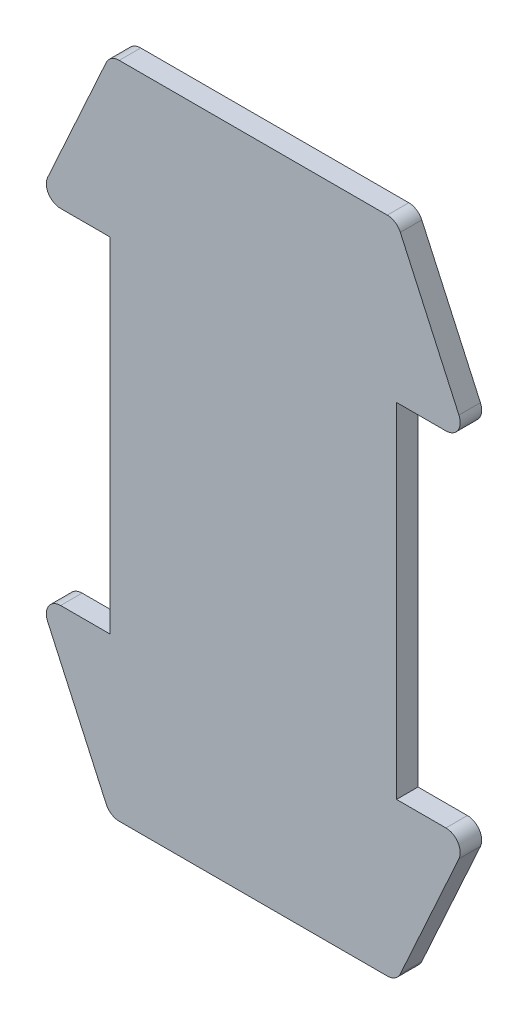
ISO-10303-21;
HEADER;
FILE_DESCRIPTION(('STEP AP214'),'2;1');
FILE_NAME('part.step','',(''),(''),'','','');
FILE_SCHEMA(('AUTOMOTIVE_DESIGN { 1 0 10303 214 1 1 1 1 }'));
ENDSEC;
DATA;
#1=APPLICATION_CONTEXT('core data for automotive mechanical design processes');
#2=APPLICATION_PROTOCOL_DEFINITION('international standard','automotive_design',2000,#1);
#3=PRODUCT_CONTEXT('',#1,'mechanical');
#4=PRODUCT('Part','Part','',(#3));
#5=PRODUCT_RELATED_PRODUCT_CATEGORY('part','',(#4));
#6=PRODUCT_DEFINITION_FORMATION('','',#4);
#7=PRODUCT_DEFINITION_CONTEXT('part definition',#1,'design');
#8=PRODUCT_DEFINITION('design','',#6,#7);
#9=PRODUCT_DEFINITION_SHAPE('','',#8);
#10=(LENGTH_UNIT() NAMED_UNIT(*) SI_UNIT(.MILLI.,.METRE.));
#11=(NAMED_UNIT(*) PLANE_ANGLE_UNIT() SI_UNIT($,.RADIAN.));
#12=(NAMED_UNIT(*) SI_UNIT($,.STERADIAN.) SOLID_ANGLE_UNIT());
#13=UNCERTAINTY_MEASURE_WITH_UNIT(LENGTH_MEASURE(1.E-05),#10,'distance_accuracy_value','');
#14=(GEOMETRIC_REPRESENTATION_CONTEXT(3) GLOBAL_UNCERTAINTY_ASSIGNED_CONTEXT((#13)) GLOBAL_UNIT_ASSIGNED_CONTEXT((#10,
#11,#12)) REPRESENTATION_CONTEXT('',''));
#15=CARTESIAN_POINT('',(0.,0.,0.));
#16=DIRECTION('',(0.,0.,1.));
#17=DIRECTION('',(1.,0.,0.));
#18=AXIS2_PLACEMENT_3D('',#15,#16,#17);
#19=CARTESIAN_POINT('',(-50.,115.,-7.5));
#20=DIRECTION('',(-0.910366477462605,0.413802944301184,0.));
#21=DIRECTION('',(-0.413802944301184,-0.910366477462605,0.));
#22=AXIS2_PLACEMENT_3D('',#19,#20,#21);
#23=PLANE('',#22);
#24=DIRECTION('',(-0.413802944301184,-0.910366477462605,0.));
#25=VECTOR('',#24,1.);
#26=CARTESIAN_POINT('',(-50.,115.,-7.5));
#27=LINE('',#26,#25);
#28=CARTESIAN_POINT('',(-51.3322660356791,112.069014721506,-7.5));
#29=VERTEX_POINT('',#28);
#30=CARTESIAN_POINT('',(-71.7868114902246,67.0690147215059,-7.5));
#31=VERTEX_POINT('',#30);
#32=EDGE_CURVE('E186',#29,#31,#27,.T.);
#33=ORIENTED_EDGE('',*,*,#32,.T.);
#34=DIRECTION('',(0.,0.,1.));
#35=VECTOR('',#34,1.);
#36=CARTESIAN_POINT('',(-71.7868114902246,67.0690147215059,-7.5));
#37=LINE('',#36,#35);
#38=CARTESIAN_POINT('',(-71.7868114902246,67.0690147215059,0.));
#39=VERTEX_POINT('',#38);
#40=EDGE_CURVE('E371',#31,#39,#37,.T.);
#41=ORIENTED_EDGE('',*,*,#40,.T.);
#42=DIRECTION('',(-0.413802944301184,-0.910366477462605,0.));
#43=VECTOR('',#42,1.);
#44=CARTESIAN_POINT('',(-50.,115.,0.));
#45=LINE('',#44,#43);
#46=CARTESIAN_POINT('',(-51.3322660356791,112.069014721506,0.));
#47=VERTEX_POINT('',#46);
#48=EDGE_CURVE('E236',#47,#39,#45,.T.);
#49=ORIENTED_EDGE('',*,*,#48,.F.);
#50=DIRECTION('',(0.,0.,1.));
#51=VECTOR('',#50,1.);
#52=CARTESIAN_POINT('',(-51.3322660356791,112.069014721506,-7.5));
#53=LINE('',#52,#51);
#54=EDGE_CURVE('E368',#47,#29,#53,.F.);
#55=ORIENTED_EDGE('',*,*,#54,.T.);
#56=EDGE_LOOP('',(#33,#41,#49,#55));
#57=FACE_BOUND('',#56,.T.);
#58=ADVANCED_FACE('F39',(#57),#23,.T.);
#59=CARTESIAN_POINT('',(50.,115.,-7.5));
#60=DIRECTION('',(0.,1.,0.));
#61=DIRECTION('',(0.,0.,1.));
#62=AXIS2_PLACEMENT_3D('',#59,#60,#61);
#63=PLANE('',#62);
#64=DIRECTION('',(-1.,0.,0.));
#65=VECTOR('',#64,1.);
#66=CARTESIAN_POINT('',(50.,115.,0.));
#67=LINE('',#66,#65);
#68=CARTESIAN_POINT('',(46.7804336483661,115.,0.));
#69=VERTEX_POINT('',#68);
#70=CARTESIAN_POINT('',(-46.7804336483661,115.,0.));
#71=VERTEX_POINT('',#70);
#72=EDGE_CURVE('E276',#69,#71,#67,.T.);
#73=ORIENTED_EDGE('',*,*,#72,.F.);
#74=DIRECTION('',(0.,0.,1.));
#75=VECTOR('',#74,1.);
#76=CARTESIAN_POINT('',(46.7804336483661,115.,-7.5));
#77=LINE('',#76,#75);
#78=CARTESIAN_POINT('',(46.7804336483661,115.,-7.5));
#79=VERTEX_POINT('',#78);
#80=EDGE_CURVE('E11',#69,#79,#77,.F.);
#81=ORIENTED_EDGE('',*,*,#80,.T.);
#82=DIRECTION('',(-1.,0.,0.));
#83=VECTOR('',#82,1.);
#84=CARTESIAN_POINT('',(50.,115.,-7.5));
#85=LINE('',#84,#83);
#86=CARTESIAN_POINT('',(-46.7804336483661,115.,-7.5));
#87=VERTEX_POINT('',#86);
#88=EDGE_CURVE('E195',#79,#87,#85,.T.);
#89=ORIENTED_EDGE('',*,*,#88,.T.);
#90=DIRECTION('',(0.,0.,1.));
#91=VECTOR('',#90,1.);
#92=CARTESIAN_POINT('',(-46.7804336483661,115.,-7.5));
#93=LINE('',#92,#91);
#94=EDGE_CURVE('E48',#87,#71,#93,.T.);
#95=ORIENTED_EDGE('',*,*,#94,.T.);
#96=EDGE_LOOP('',(#73,#81,#89,#95));
#97=FACE_BOUND('',#96,.T.);
#98=ADVANCED_FACE('F388',(#97),#63,.T.);
#99=CARTESIAN_POINT('',(50.,115.,-7.5));
#100=DIRECTION('',(0.910366477462605,0.413802944301184,0.));
#101=DIRECTION('',(-0.413802944301184,0.910366477462605,0.));
#102=AXIS2_PLACEMENT_3D('',#99,#100,#101);
#103=PLANE('',#102);
#104=DIRECTION('',(-0.413802944301184,0.910366477462605,0.));
#105=VECTOR('',#104,1.);
#106=CARTESIAN_POINT('',(50.,115.,0.));
#107=LINE('',#106,#105);
#108=CARTESIAN_POINT('',(71.7868114902246,67.0690147215059,0.));
#109=VERTEX_POINT('',#108);
#110=CARTESIAN_POINT('',(51.3322660356791,112.069014721506,0.));
#111=VERTEX_POINT('',#110);
#112=EDGE_CURVE('E272',#109,#111,#107,.T.);
#113=ORIENTED_EDGE('',*,*,#112,.F.);
#114=DIRECTION('',(0.,0.,1.));
#115=VECTOR('',#114,1.);
#116=CARTESIAN_POINT('',(71.7868114902246,67.0690147215059,-7.5));
#117=LINE('',#116,#115);
#118=CARTESIAN_POINT('',(71.7868114902246,67.0690147215059,-7.5));
#119=VERTEX_POINT('',#118);
#120=EDGE_CURVE('E365',#109,#119,#117,.F.);
#121=ORIENTED_EDGE('',*,*,#120,.T.);
#122=DIRECTION('',(-0.413802944301184,0.910366477462605,0.));
#123=VECTOR('',#122,1.);
#124=CARTESIAN_POINT('',(50.,115.,-7.5));
#125=LINE('',#124,#123);
#126=CARTESIAN_POINT('',(51.3322660356791,112.069014721506,-7.5));
#127=VERTEX_POINT('',#126);
#128=EDGE_CURVE('E229',#119,#127,#125,.T.);
#129=ORIENTED_EDGE('',*,*,#128,.T.);
#130=DIRECTION('',(0.,0.,1.));
#131=VECTOR('',#130,1.);
#132=CARTESIAN_POINT('',(51.3322660356791,112.069014721506,-7.5));
#133=LINE('',#132,#131);
#134=EDGE_CURVE('E361',#127,#111,#133,.T.);
#135=ORIENTED_EDGE('',*,*,#134,.T.);
#136=EDGE_LOOP('',(#113,#121,#129,#135));
#137=FACE_BOUND('',#136,.T.);
#138=ADVANCED_FACE('F402',(#137),#103,.T.);
#139=CARTESIAN_POINT('',(75.,60.,-7.5));
#140=DIRECTION('',(0.,-1.,0.));
#141=DIRECTION('',(1.,0.,0.));
#142=AXIS2_PLACEMENT_3D('',#139,#140,#141);
#143=PLANE('',#142);
#144=DIRECTION('',(1.,0.,0.));
#145=VECTOR('',#144,1.);
#146=CARTESIAN_POINT('',(75.,60.,-7.5));
#147=LINE('',#146,#145);
#148=CARTESIAN_POINT('',(50.,60.,-7.5));
#149=VERTEX_POINT('',#148);
#150=CARTESIAN_POINT('',(67.2349791029116,60.,-7.5));
#151=VERTEX_POINT('',#150);
#152=EDGE_CURVE('E225',#149,#151,#147,.T.);
#153=ORIENTED_EDGE('',*,*,#152,.T.);
#154=DIRECTION('',(0.,0.,1.));
#155=VECTOR('',#154,1.);
#156=CARTESIAN_POINT('',(67.2349791029116,60.,-7.5));
#157=LINE('',#156,#155);
#158=CARTESIAN_POINT('',(67.2349791029116,60.,0.));
#159=VERTEX_POINT('',#158);
#160=EDGE_CURVE('E357',#151,#159,#157,.T.);
#161=ORIENTED_EDGE('',*,*,#160,.T.);
#162=DIRECTION('',(1.,0.,0.));
#163=VECTOR('',#162,1.);
#164=CARTESIAN_POINT('',(75.,60.,0.));
#165=LINE('',#164,#163);
#166=CARTESIAN_POINT('',(50.,60.,0.));
#167=VERTEX_POINT('',#166);
#168=EDGE_CURVE('E268',#167,#159,#165,.T.);
#169=ORIENTED_EDGE('',*,*,#168,.F.);
#170=DIRECTION('',(0.,0.,1.));
#171=VECTOR('',#170,1.);
#172=CARTESIAN_POINT('',(50.,60.,-7.5));
#173=LINE('',#172,#171);
#174=EDGE_CURVE('E280',#149,#167,#173,.T.);
#175=ORIENTED_EDGE('',*,*,#174,.F.);
#176=EDGE_LOOP('',(#153,#161,#169,#175));
#177=FACE_BOUND('',#176,.T.);
#178=ADVANCED_FACE('F412',(#177),#143,.T.);
#179=CARTESIAN_POINT('',(50.,60.,-7.5));
#180=DIRECTION('',(1.,0.,0.));
#181=DIRECTION('',(0.,0.,-1.));
#182=AXIS2_PLACEMENT_3D('',#179,#180,#181);
#183=PLANE('',#182);
#184=DIRECTION('',(0.,1.,0.));
#185=VECTOR('',#184,1.);
#186=CARTESIAN_POINT('',(50.,60.,0.));
#187=LINE('',#186,#185);
#188=CARTESIAN_POINT('',(50.,-60.,0.));
#189=VERTEX_POINT('',#188);
#190=EDGE_CURVE('E264',#189,#167,#187,.T.);
#191=ORIENTED_EDGE('',*,*,#190,.F.);
#192=DIRECTION('',(0.,0.,1.));
#193=VECTOR('',#192,1.);
#194=CARTESIAN_POINT('',(50.,-60.,-7.5));
#195=LINE('',#194,#193);
#196=CARTESIAN_POINT('',(50.,-60.,-7.5));
#197=VERTEX_POINT('',#196);
#198=EDGE_CURVE('E284',#197,#189,#195,.T.);
#199=ORIENTED_EDGE('',*,*,#198,.F.);
#200=DIRECTION('',(0.,1.,0.));
#201=VECTOR('',#200,1.);
#202=CARTESIAN_POINT('',(50.,60.,-7.5));
#203=LINE('',#202,#201);
#204=EDGE_CURVE('E221',#197,#149,#203,.T.);
#205=ORIENTED_EDGE('',*,*,#204,.T.);
#206=ORIENTED_EDGE('',*,*,#174,.T.);
#207=EDGE_LOOP('',(#191,#199,#205,#206));
#208=FACE_BOUND('',#207,.T.);
#209=ADVANCED_FACE('F417',(#208),#183,.T.);
#210=CARTESIAN_POINT('',(75.,-60.,-7.5));
#211=DIRECTION('',(0.,1.,0.));
#212=DIRECTION('',(-1.,0.,0.));
#213=AXIS2_PLACEMENT_3D('',#210,#211,#212);
#214=PLANE('',#213);
#215=DIRECTION('',(-1.,0.,0.));
#216=VECTOR('',#215,1.);
#217=CARTESIAN_POINT('',(75.,-60.,0.));
#218=LINE('',#217,#216);
#219=CARTESIAN_POINT('',(67.2349791029116,-60.,0.));
#220=VERTEX_POINT('',#219);
#221=EDGE_CURVE('E261',#220,#189,#218,.T.);
#222=ORIENTED_EDGE('',*,*,#221,.F.);
#223=DIRECTION('',(0.,0.,1.));
#224=VECTOR('',#223,1.);
#225=CARTESIAN_POINT('',(67.2349791029116,-60.,-7.5));
#226=LINE('',#225,#224);
#227=CARTESIAN_POINT('',(67.2349791029116,-60.,-7.5));
#228=VERTEX_POINT('',#227);
#229=EDGE_CURVE('E381',#220,#228,#226,.F.);
#230=ORIENTED_EDGE('',*,*,#229,.T.);
#231=DIRECTION('',(-1.,0.,0.));
#232=VECTOR('',#231,1.);
#233=CARTESIAN_POINT('',(75.,-60.,-7.5));
#234=LINE('',#233,#232);
#235=EDGE_CURVE('E218',#228,#197,#234,.T.);
#236=ORIENTED_EDGE('',*,*,#235,.T.);
#237=ORIENTED_EDGE('',*,*,#198,.T.);
#238=EDGE_LOOP('',(#222,#230,#236,#237));
#239=FACE_BOUND('',#238,.T.);
#240=ADVANCED_FACE('F581',(#239),#214,.T.);
#241=CARTESIAN_POINT('',(50.,-115.,-7.5));
#242=DIRECTION('',(0.910366477462605,-0.413802944301184,0.));
#243=DIRECTION('',(0.413802944301184,0.910366477462605,0.));
#244=AXIS2_PLACEMENT_3D('',#241,#242,#243);
#245=PLANE('',#244);
#246=DIRECTION('',(0.413802944301184,0.910366477462605,0.));
#247=VECTOR('',#246,1.);
#248=CARTESIAN_POINT('',(50.,-115.,0.));
#249=LINE('',#248,#247);
#250=CARTESIAN_POINT('',(51.3322660356791,-112.069014721506,0.));
#251=VERTEX_POINT('',#250);
#252=CARTESIAN_POINT('',(71.7868114902246,-67.0690147215059,0.));
#253=VERTEX_POINT('',#252);
#254=EDGE_CURVE('E257',#251,#253,#249,.T.);
#255=ORIENTED_EDGE('',*,*,#254,.F.);
#256=DIRECTION('',(0.,0.,1.));
#257=VECTOR('',#256,1.);
#258=CARTESIAN_POINT('',(51.3322660356791,-112.069014721506,-7.5));
#259=LINE('',#258,#257);
#260=CARTESIAN_POINT('',(51.3322660356791,-112.069014721506,-7.5));
#261=VERTEX_POINT('',#260);
#262=EDGE_CURVE('E354',#251,#261,#259,.F.);
#263=ORIENTED_EDGE('',*,*,#262,.T.);
#264=DIRECTION('',(0.413802944301184,0.910366477462605,0.));
#265=VECTOR('',#264,1.);
#266=CARTESIAN_POINT('',(50.,-115.,-7.5));
#267=LINE('',#266,#265);
#268=CARTESIAN_POINT('',(71.7868114902246,-67.0690147215059,-7.5));
#269=VERTEX_POINT('',#268);
#270=EDGE_CURVE('E214',#261,#269,#267,.T.);
#271=ORIENTED_EDGE('',*,*,#270,.T.);
#272=DIRECTION('',(0.,0.,1.));
#273=VECTOR('',#272,1.);
#274=CARTESIAN_POINT('',(71.7868114902246,-67.0690147215059,-7.5));
#275=LINE('',#274,#273);
#276=EDGE_CURVE('E350',#269,#253,#275,.T.);
#277=ORIENTED_EDGE('',*,*,#276,.T.);
#278=EDGE_LOOP('',(#255,#263,#271,#277));
#279=FACE_BOUND('',#278,.T.);
#280=ADVANCED_FACE('F429',(#279),#245,.T.);
#281=CARTESIAN_POINT('',(50.,-115.,-7.5));
#282=DIRECTION('',(0.,-1.,0.));
#283=DIRECTION('',(0.,0.,-1.));
#284=AXIS2_PLACEMENT_3D('',#281,#282,#283);
#285=PLANE('',#284);
#286=DIRECTION('',(1.,0.,0.));
#287=VECTOR('',#286,1.);
#288=CARTESIAN_POINT('',(50.,-115.,0.));
#289=LINE('',#288,#287);
#290=CARTESIAN_POINT('',(-46.7804336483661,-115.,0.));
#291=VERTEX_POINT('',#290);
#292=CARTESIAN_POINT('',(46.7804336483661,-115.,0.));
#293=VERTEX_POINT('',#292);
#294=EDGE_CURVE('E253',#291,#293,#289,.T.);
#295=ORIENTED_EDGE('',*,*,#294,.F.);
#296=DIRECTION('',(0.,0.,1.));
#297=VECTOR('',#296,1.);
#298=CARTESIAN_POINT('',(-46.7804336483661,-115.,-7.5));
#299=LINE('',#298,#297);
#300=CARTESIAN_POINT('',(-46.7804336483661,-115.,-7.5));
#301=VERTEX_POINT('',#300);
#302=EDGE_CURVE('E324',#291,#301,#299,.F.);
#303=ORIENTED_EDGE('',*,*,#302,.T.);
#304=DIRECTION('',(1.,0.,0.));
#305=VECTOR('',#304,1.);
#306=CARTESIAN_POINT('',(50.,-115.,-7.5));
#307=LINE('',#306,#305);
#308=CARTESIAN_POINT('',(46.7804336483661,-115.,-7.5));
#309=VERTEX_POINT('',#308);
#310=EDGE_CURVE('E210',#301,#309,#307,.T.);
#311=ORIENTED_EDGE('',*,*,#310,.T.);
#312=DIRECTION('',(0.,0.,1.));
#313=VECTOR('',#312,1.);
#314=CARTESIAN_POINT('',(46.7804336483661,-115.,-7.5));
#315=LINE('',#314,#313);
#316=EDGE_CURVE('E320',#309,#293,#315,.T.);
#317=ORIENTED_EDGE('',*,*,#316,.T.);
#318=EDGE_LOOP('',(#295,#303,#311,#317));
#319=FACE_BOUND('',#318,.T.);
#320=ADVANCED_FACE('F437',(#319),#285,.T.);
#321=CARTESIAN_POINT('',(-50.,-115.,-7.5));
#322=DIRECTION('',(-0.910366477462605,-0.413802944301184,0.));
#323=DIRECTION('',(0.413802944301184,-0.910366477462605,0.));
#324=AXIS2_PLACEMENT_3D('',#321,#322,#323);
#325=PLANE('',#324);
#326=DIRECTION('',(0.413802944301184,-0.910366477462605,0.));
#327=VECTOR('',#326,1.);
#328=CARTESIAN_POINT('',(-50.,-115.,-7.5));
#329=LINE('',#328,#327);
#330=CARTESIAN_POINT('',(-71.7868114902246,-67.0690147215059,-7.5));
#331=VERTEX_POINT('',#330);
#332=CARTESIAN_POINT('',(-51.3322660356791,-112.069014721506,-7.5));
#333=VERTEX_POINT('',#332);
#334=EDGE_CURVE('E203',#331,#333,#329,.T.);
#335=ORIENTED_EDGE('',*,*,#334,.T.);
#336=DIRECTION('',(0.,0.,1.));
#337=VECTOR('',#336,1.);
#338=CARTESIAN_POINT('',(-51.3322660356791,-112.069014721506,-7.5));
#339=LINE('',#338,#337);
#340=CARTESIAN_POINT('',(-51.3322660356791,-112.069014721506,0.));
#341=VERTEX_POINT('',#340);
#342=EDGE_CURVE('E292',#333,#341,#339,.T.);
#343=ORIENTED_EDGE('',*,*,#342,.T.);
#344=DIRECTION('',(0.413802944301184,-0.910366477462605,0.));
#345=VECTOR('',#344,1.);
#346=CARTESIAN_POINT('',(-50.,-115.,0.));
#347=LINE('',#346,#345);
#348=CARTESIAN_POINT('',(-71.7868114902246,-67.0690147215059,0.));
#349=VERTEX_POINT('',#348);
#350=EDGE_CURVE('E249',#349,#341,#347,.T.);
#351=ORIENTED_EDGE('',*,*,#350,.F.);
#352=DIRECTION('',(0.,0.,1.));
#353=VECTOR('',#352,1.);
#354=CARTESIAN_POINT('',(-71.7868114902246,-67.0690147215059,-7.5));
#355=LINE('',#354,#353);
#356=EDGE_CURVE('E283',#349,#331,#355,.F.);
#357=ORIENTED_EDGE('',*,*,#356,.T.);
#358=EDGE_LOOP('',(#335,#343,#351,#357));
#359=FACE_BOUND('',#358,.T.);
#360=ADVANCED_FACE('F445',(#359),#325,.T.);
#361=CARTESIAN_POINT('',(-75.,-60.,-7.5));
#362=DIRECTION('',(0.,1.,0.));
#363=DIRECTION('',(-1.,0.,0.));
#364=AXIS2_PLACEMENT_3D('',#361,#362,#363);
#365=PLANE('',#364);
#366=DIRECTION('',(-1.,0.,0.));
#367=VECTOR('',#366,1.);
#368=CARTESIAN_POINT('',(-75.,-60.,-7.5));
#369=LINE('',#368,#367);
#370=CARTESIAN_POINT('',(-50.,-60.,-7.5));
#371=VERTEX_POINT('',#370);
#372=CARTESIAN_POINT('',(-67.2349791029116,-60.,-7.5));
#373=VERTEX_POINT('',#372);
#374=EDGE_CURVE('E199',#371,#373,#369,.T.);
#375=ORIENTED_EDGE('',*,*,#374,.T.);
#376=DIRECTION('',(0.,0.,1.));
#377=VECTOR('',#376,1.);
#378=CARTESIAN_POINT('',(-67.2349791029116,-60.,-7.5));
#379=LINE('',#378,#377);
#380=CARTESIAN_POINT('',(-67.2349791029116,-60.,0.));
#381=VERTEX_POINT('',#380);
#382=EDGE_CURVE('E377',#373,#381,#379,.T.);
#383=ORIENTED_EDGE('',*,*,#382,.T.);
#384=DIRECTION('',(-1.,0.,0.));
#385=VECTOR('',#384,1.);
#386=CARTESIAN_POINT('',(-75.,-60.,0.));
#387=LINE('',#386,#385);
#388=CARTESIAN_POINT('',(-50.,-60.,0.));
#389=VERTEX_POINT('',#388);
#390=EDGE_CURVE('E245',#389,#381,#387,.T.);
#391=ORIENTED_EDGE('',*,*,#390,.F.);
#392=DIRECTION('',(0.,0.,1.));
#393=VECTOR('',#392,1.);
#394=CARTESIAN_POINT('',(-50.,-60.,-7.5));
#395=LINE('',#394,#393);
#396=EDGE_CURVE('E194',#371,#389,#395,.T.);
#397=ORIENTED_EDGE('',*,*,#396,.F.);
#398=EDGE_LOOP('',(#375,#383,#391,#397));
#399=FACE_BOUND('',#398,.T.);
#400=ADVANCED_FACE('F452',(#399),#365,.T.);
#401=CARTESIAN_POINT('',(-50.,60.,-7.5));
#402=DIRECTION('',(-1.,0.,0.));
#403=DIRECTION('',(0.,0.,1.));
#404=AXIS2_PLACEMENT_3D('',#401,#402,#403);
#405=PLANE('',#404);
#406=DIRECTION('',(0.,-1.,0.));
#407=VECTOR('',#406,1.);
#408=CARTESIAN_POINT('',(-50.,60.,0.));
#409=LINE('',#408,#407);
#410=CARTESIAN_POINT('',(-50.,60.,0.));
#411=VERTEX_POINT('',#410);
#412=EDGE_CURVE('E192',#411,#389,#409,.T.);
#413=ORIENTED_EDGE('',*,*,#412,.F.);
#414=DIRECTION('',(0.,0.,1.));
#415=VECTOR('',#414,1.);
#416=CARTESIAN_POINT('',(-50.,60.,-7.5));
#417=LINE('',#416,#415);
#418=CARTESIAN_POINT('',(-50.,60.,-7.5));
#419=VERTEX_POINT('',#418);
#420=EDGE_CURVE('E180',#419,#411,#417,.T.);
#421=ORIENTED_EDGE('',*,*,#420,.F.);
#422=DIRECTION('',(0.,-1.,0.));
#423=VECTOR('',#422,1.);
#424=CARTESIAN_POINT('',(-50.,60.,-7.5));
#425=LINE('',#424,#423);
#426=EDGE_CURVE('E185',#419,#371,#425,.T.);
#427=ORIENTED_EDGE('',*,*,#426,.T.);
#428=ORIENTED_EDGE('',*,*,#396,.T.);
#429=EDGE_LOOP('',(#413,#421,#427,#428));
#430=FACE_BOUND('',#429,.T.);
#431=ADVANCED_FACE('F190',(#430),#405,.T.);
#432=CARTESIAN_POINT('',(-75.,60.,-7.5));
#433=DIRECTION('',(0.,-1.,0.));
#434=DIRECTION('',(1.,0.,0.));
#435=AXIS2_PLACEMENT_3D('',#432,#433,#434);
#436=PLANE('',#435);
#437=DIRECTION('',(1.,0.,0.));
#438=VECTOR('',#437,1.);
#439=CARTESIAN_POINT('',(-75.,60.,0.));
#440=LINE('',#439,#438);
#441=CARTESIAN_POINT('',(-67.2349791029116,60.,0.));
#442=VERTEX_POINT('',#441);
#443=EDGE_CURVE('E240',#442,#411,#440,.T.);
#444=ORIENTED_EDGE('',*,*,#443,.F.);
#445=DIRECTION('',(0.,0.,1.));
#446=VECTOR('',#445,1.);
#447=CARTESIAN_POINT('',(-67.2349791029116,60.,-7.5));
#448=LINE('',#447,#446);
#449=CARTESIAN_POINT('',(-67.2349791029116,60.,-7.5));
#450=VERTEX_POINT('',#449);
#451=EDGE_CURVE('E55',#442,#450,#448,.F.);
#452=ORIENTED_EDGE('',*,*,#451,.T.);
#453=DIRECTION('',(1.,0.,0.));
#454=VECTOR('',#453,1.);
#455=CARTESIAN_POINT('',(-75.,60.,-7.5));
#456=LINE('',#455,#454);
#457=EDGE_CURVE('E177',#450,#419,#456,.T.);
#458=ORIENTED_EDGE('',*,*,#457,.T.);
#459=ORIENTED_EDGE('',*,*,#420,.T.);
#460=EDGE_LOOP('',(#444,#452,#458,#459));
#461=FACE_BOUND('',#460,.T.);
#462=ADVANCED_FACE('F179',(#461),#436,.T.);
#463=CARTESIAN_POINT('',(0.,0.,-7.5));
#464=DIRECTION('',(0.,0.,1.));
#465=DIRECTION('',(1.,0.,0.));
#466=AXIS2_PLACEMENT_3D('',#463,#464,#465);
#467=PLANE('',#466);
#468=ORIENTED_EDGE('',*,*,#310,.F.);
#469=CARTESIAN_POINT('',(-46.7804336483661,-110.,-7.5));
#470=DIRECTION('',(0.,0.,1.));
#471=DIRECTION('',(1.,0.,0.));
#472=AXIS2_PLACEMENT_3D('',#469,#470,#471);
#473=CIRCLE('',#472,5.);
#474=EDGE_CURVE('E347',#301,#333,#473,.F.);
#475=ORIENTED_EDGE('',*,*,#474,.T.);
#476=ORIENTED_EDGE('',*,*,#334,.F.);
#477=CARTESIAN_POINT('',(-67.2349791029116,-65.,-7.5));
#478=DIRECTION('',(0.,0.,1.));
#479=DIRECTION('',(1.,0.,0.));
#480=AXIS2_PLACEMENT_3D('',#477,#478,#479);
#481=CIRCLE('',#480,5.);
#482=EDGE_CURVE('E63',#331,#373,#481,.F.);
#483=ORIENTED_EDGE('',*,*,#482,.T.);
#484=ORIENTED_EDGE('',*,*,#374,.F.);
#485=ORIENTED_EDGE('',*,*,#426,.F.);
#486=ORIENTED_EDGE('',*,*,#457,.F.);
#487=CARTESIAN_POINT('',(-67.2349791029116,65.,-7.5));
#488=DIRECTION('',(0.,0.,1.));
#489=DIRECTION('',(1.,0.,0.));
#490=AXIS2_PLACEMENT_3D('',#487,#488,#489);
#491=CIRCLE('',#490,5.);
#492=EDGE_CURVE('E338',#450,#31,#491,.F.);
#493=ORIENTED_EDGE('',*,*,#492,.T.);
#494=ORIENTED_EDGE('',*,*,#32,.F.);
#495=CARTESIAN_POINT('',(-46.7804336483661,110.,-7.5));
#496=DIRECTION('',(0.,0.,1.));
#497=DIRECTION('',(1.,0.,0.));
#498=AXIS2_PLACEMENT_3D('',#495,#496,#497);
#499=CIRCLE('',#498,5.);
#500=EDGE_CURVE('E327',#29,#87,#499,.F.);
#501=ORIENTED_EDGE('',*,*,#500,.T.);
#502=ORIENTED_EDGE('',*,*,#88,.F.);
#503=CARTESIAN_POINT('',(46.7804336483661,110.,-7.5));
#504=DIRECTION('',(0.,0.,1.));
#505=DIRECTION('',(1.,0.,0.));
#506=AXIS2_PLACEMENT_3D('',#503,#504,#505);
#507=CIRCLE('',#506,5.);
#508=EDGE_CURVE('E330',#79,#127,#507,.F.);
#509=ORIENTED_EDGE('',*,*,#508,.T.);
#510=ORIENTED_EDGE('',*,*,#128,.F.);
#511=CARTESIAN_POINT('',(67.2349791029116,65.,-7.5));
#512=DIRECTION('',(0.,0.,1.));
#513=DIRECTION('',(1.,0.,0.));
#514=AXIS2_PLACEMENT_3D('',#511,#512,#513);
#515=CIRCLE('',#514,5.);
#516=EDGE_CURVE('E341',#119,#151,#515,.F.);
#517=ORIENTED_EDGE('',*,*,#516,.T.);
#518=ORIENTED_EDGE('',*,*,#152,.F.);
#519=ORIENTED_EDGE('',*,*,#204,.F.);
#520=ORIENTED_EDGE('',*,*,#235,.F.);
#521=CARTESIAN_POINT('',(67.2349791029116,-65.,-7.5));
#522=DIRECTION('',(0.,0.,1.));
#523=DIRECTION('',(1.,0.,0.));
#524=AXIS2_PLACEMENT_3D('',#521,#522,#523);
#525=CIRCLE('',#524,5.);
#526=EDGE_CURVE('E333',#228,#269,#525,.F.);
#527=ORIENTED_EDGE('',*,*,#526,.T.);
#528=ORIENTED_EDGE('',*,*,#270,.F.);
#529=CARTESIAN_POINT('',(46.7804336483661,-110.,-7.5));
#530=DIRECTION('',(0.,0.,1.));
#531=DIRECTION('',(1.,0.,0.));
#532=AXIS2_PLACEMENT_3D('',#529,#530,#531);
#533=CIRCLE('',#532,5.);
#534=EDGE_CURVE('E344',#261,#309,#533,.F.);
#535=ORIENTED_EDGE('',*,*,#534,.T.);
#536=EDGE_LOOP('',(#468,#475,#476,#483,#484,#485,#486,#493,#494,#501,#502,#509,#510,#517,#518,
#519,#520,#527,#528,#535));
#537=FACE_BOUND('',#536,.T.);
#538=ADVANCED_FACE('F198',(#537),#467,.F.);
#539=CARTESIAN_POINT('',(0.,0.,0.));
#540=DIRECTION('',(0.,0.,1.));
#541=DIRECTION('',(1.,0.,0.));
#542=AXIS2_PLACEMENT_3D('',#539,#540,#541);
#543=PLANE('',#542);
#544=ORIENTED_EDGE('',*,*,#350,.T.);
#545=CARTESIAN_POINT('',(-46.7804336483661,-110.,0.));
#546=DIRECTION('',(0.,0.,1.));
#547=DIRECTION('',(1.,0.,0.));
#548=AXIS2_PLACEMENT_3D('',#545,#546,#547);
#549=CIRCLE('',#548,5.);
#550=EDGE_CURVE('E317',#341,#291,#549,.T.);
#551=ORIENTED_EDGE('',*,*,#550,.T.);
#552=ORIENTED_EDGE('',*,*,#294,.T.);
#553=CARTESIAN_POINT('',(46.7804336483661,-110.,0.));
#554=DIRECTION('',(0.,0.,1.));
#555=DIRECTION('',(1.,0.,0.));
#556=AXIS2_PLACEMENT_3D('',#553,#554,#555);
#557=CIRCLE('',#556,5.);
#558=EDGE_CURVE('E314',#293,#251,#557,.T.);
#559=ORIENTED_EDGE('',*,*,#558,.T.);
#560=ORIENTED_EDGE('',*,*,#254,.T.);
#561=CARTESIAN_POINT('',(67.2349791029116,-65.,0.));
#562=DIRECTION('',(0.,0.,1.));
#563=DIRECTION('',(1.,0.,0.));
#564=AXIS2_PLACEMENT_3D('',#561,#562,#563);
#565=CIRCLE('',#564,5.);
#566=EDGE_CURVE('E302',#253,#220,#565,.T.);
#567=ORIENTED_EDGE('',*,*,#566,.T.);
#568=ORIENTED_EDGE('',*,*,#221,.T.);
#569=ORIENTED_EDGE('',*,*,#190,.T.);
#570=ORIENTED_EDGE('',*,*,#168,.T.);
#571=CARTESIAN_POINT('',(67.2349791029116,65.,0.));
#572=DIRECTION('',(0.,0.,1.));
#573=DIRECTION('',(1.,0.,0.));
#574=AXIS2_PLACEMENT_3D('',#571,#572,#573);
#575=CIRCLE('',#574,5.);
#576=EDGE_CURVE('E311',#159,#109,#575,.T.);
#577=ORIENTED_EDGE('',*,*,#576,.T.);
#578=ORIENTED_EDGE('',*,*,#112,.T.);
#579=CARTESIAN_POINT('',(46.7804336483661,110.,0.));
#580=DIRECTION('',(0.,0.,1.));
#581=DIRECTION('',(1.,0.,0.));
#582=AXIS2_PLACEMENT_3D('',#579,#580,#581);
#583=CIRCLE('',#582,5.);
#584=EDGE_CURVE('E299',#111,#69,#583,.T.);
#585=ORIENTED_EDGE('',*,*,#584,.T.);
#586=ORIENTED_EDGE('',*,*,#72,.T.);
#587=CARTESIAN_POINT('',(-46.7804336483661,110.,0.));
#588=DIRECTION('',(0.,0.,1.));
#589=DIRECTION('',(1.,0.,0.));
#590=AXIS2_PLACEMENT_3D('',#587,#588,#589);
#591=CIRCLE('',#590,5.);
#592=EDGE_CURVE('E296',#71,#47,#591,.T.);
#593=ORIENTED_EDGE('',*,*,#592,.T.);
#594=ORIENTED_EDGE('',*,*,#48,.T.);
#595=CARTESIAN_POINT('',(-67.2349791029116,65.,0.));
#596=DIRECTION('',(0.,0.,1.));
#597=DIRECTION('',(1.,0.,0.));
#598=AXIS2_PLACEMENT_3D('',#595,#596,#597);
#599=CIRCLE('',#598,5.);
#600=EDGE_CURVE('E308',#39,#442,#599,.T.);
#601=ORIENTED_EDGE('',*,*,#600,.T.);
#602=ORIENTED_EDGE('',*,*,#443,.T.);
#603=ORIENTED_EDGE('',*,*,#412,.T.);
#604=ORIENTED_EDGE('',*,*,#390,.T.);
#605=CARTESIAN_POINT('',(-67.2349791029116,-65.,0.));
#606=DIRECTION('',(0.,0.,1.));
#607=DIRECTION('',(1.,0.,0.));
#608=AXIS2_PLACEMENT_3D('',#605,#606,#607);
#609=CIRCLE('',#608,5.);
#610=EDGE_CURVE('E305',#381,#349,#609,.T.);
#611=ORIENTED_EDGE('',*,*,#610,.T.);
#612=EDGE_LOOP('',(#544,#551,#552,#559,#560,#567,#568,#569,#570,#577,#578,#585,#586,#593,#594,
#601,#602,#603,#604,#611));
#613=FACE_BOUND('',#612,.T.);
#614=ADVANCED_FACE('F394',(#613),#543,.T.);
#615=CARTESIAN_POINT('',(-46.7804336483661,-110.,-7.5));
#616=DIRECTION('',(0.,0.,1.));
#617=DIRECTION('',(1.,0.,0.));
#618=AXIS2_PLACEMENT_3D('',#615,#616,#617);
#619=CYLINDRICAL_SURFACE('',#618,5.);
#620=ORIENTED_EDGE('',*,*,#474,.F.);
#621=ORIENTED_EDGE('',*,*,#302,.F.);
#622=ORIENTED_EDGE('',*,*,#550,.F.);
#623=ORIENTED_EDGE('',*,*,#342,.F.);
#624=EDGE_LOOP('',(#620,#621,#622,#623));
#625=FACE_BOUND('',#624,.T.);
#626=ADVANCED_FACE('F442',(#625),#619,.T.);
#627=CARTESIAN_POINT('',(46.7804336483661,-110.,-7.5));
#628=DIRECTION('',(0.,0.,1.));
#629=DIRECTION('',(1.,0.,0.));
#630=AXIS2_PLACEMENT_3D('',#627,#628,#629);
#631=CYLINDRICAL_SURFACE('',#630,5.);
#632=ORIENTED_EDGE('',*,*,#534,.F.);
#633=ORIENTED_EDGE('',*,*,#262,.F.);
#634=ORIENTED_EDGE('',*,*,#558,.F.);
#635=ORIENTED_EDGE('',*,*,#316,.F.);
#636=EDGE_LOOP('',(#632,#633,#634,#635));
#637=FACE_BOUND('',#636,.T.);
#638=ADVANCED_FACE('F435',(#637),#631,.T.);
#639=CARTESIAN_POINT('',(67.2349791029116,65.,-7.5));
#640=DIRECTION('',(0.,0.,1.));
#641=DIRECTION('',(1.,0.,0.));
#642=AXIS2_PLACEMENT_3D('',#639,#640,#641);
#643=CYLINDRICAL_SURFACE('',#642,5.);
#644=ORIENTED_EDGE('',*,*,#516,.F.);
#645=ORIENTED_EDGE('',*,*,#120,.F.);
#646=ORIENTED_EDGE('',*,*,#576,.F.);
#647=ORIENTED_EDGE('',*,*,#160,.F.);
#648=EDGE_LOOP('',(#644,#645,#646,#647));
#649=FACE_BOUND('',#648,.T.);
#650=ADVANCED_FACE('F409',(#649),#643,.T.);
#651=CARTESIAN_POINT('',(-67.2349791029116,65.,-7.5));
#652=DIRECTION('',(0.,0.,1.));
#653=DIRECTION('',(1.,0.,0.));
#654=AXIS2_PLACEMENT_3D('',#651,#652,#653);
#655=CYLINDRICAL_SURFACE('',#654,5.);
#656=ORIENTED_EDGE('',*,*,#492,.F.);
#657=ORIENTED_EDGE('',*,*,#451,.F.);
#658=ORIENTED_EDGE('',*,*,#600,.F.);
#659=ORIENTED_EDGE('',*,*,#40,.F.);
#660=EDGE_LOOP('',(#656,#657,#658,#659));
#661=FACE_BOUND('',#660,.T.);
#662=ADVANCED_FACE('F454',(#661),#655,.T.);
#663=CARTESIAN_POINT('',(-67.2349791029116,-65.,-7.5));
#664=DIRECTION('',(0.,0.,1.));
#665=DIRECTION('',(1.,0.,0.));
#666=AXIS2_PLACEMENT_3D('',#663,#664,#665);
#667=CYLINDRICAL_SURFACE('',#666,5.);
#668=ORIENTED_EDGE('',*,*,#482,.F.);
#669=ORIENTED_EDGE('',*,*,#356,.F.);
#670=ORIENTED_EDGE('',*,*,#610,.F.);
#671=ORIENTED_EDGE('',*,*,#382,.F.);
#672=EDGE_LOOP('',(#668,#669,#670,#671));
#673=FACE_BOUND('',#672,.T.);
#674=ADVANCED_FACE('F450',(#673),#667,.T.);
#675=CARTESIAN_POINT('',(67.2349791029116,-65.,-7.5));
#676=DIRECTION('',(0.,0.,1.));
#677=DIRECTION('',(1.,0.,0.));
#678=AXIS2_PLACEMENT_3D('',#675,#676,#677);
#679=CYLINDRICAL_SURFACE('',#678,5.);
#680=ORIENTED_EDGE('',*,*,#526,.F.);
#681=ORIENTED_EDGE('',*,*,#229,.F.);
#682=ORIENTED_EDGE('',*,*,#566,.F.);
#683=ORIENTED_EDGE('',*,*,#276,.F.);
#684=EDGE_LOOP('',(#680,#681,#682,#683));
#685=FACE_BOUND('',#684,.T.);
#686=ADVANCED_FACE('F426',(#685),#679,.T.);
#687=CARTESIAN_POINT('',(46.7804336483661,110.,-7.5));
#688=DIRECTION('',(0.,0.,1.));
#689=DIRECTION('',(1.,0.,0.));
#690=AXIS2_PLACEMENT_3D('',#687,#688,#689);
#691=CYLINDRICAL_SURFACE('',#690,5.);
#692=ORIENTED_EDGE('',*,*,#508,.F.);
#693=ORIENTED_EDGE('',*,*,#80,.F.);
#694=ORIENTED_EDGE('',*,*,#584,.F.);
#695=ORIENTED_EDGE('',*,*,#134,.F.);
#696=EDGE_LOOP('',(#692,#693,#694,#695));
#697=FACE_BOUND('',#696,.T.);
#698=ADVANCED_FACE('F400',(#697),#691,.T.);
#699=CARTESIAN_POINT('',(-46.7804336483661,110.,-7.5));
#700=DIRECTION('',(0.,0.,1.));
#701=DIRECTION('',(1.,0.,0.));
#702=AXIS2_PLACEMENT_3D('',#699,#700,#701);
#703=CYLINDRICAL_SURFACE('',#702,5.);
#704=ORIENTED_EDGE('',*,*,#500,.F.);
#705=ORIENTED_EDGE('',*,*,#54,.F.);
#706=ORIENTED_EDGE('',*,*,#592,.F.);
#707=ORIENTED_EDGE('',*,*,#94,.F.);
#708=EDGE_LOOP('',(#704,#705,#706,#707));
#709=FACE_BOUND('',#708,.T.);
#710=ADVANCED_FACE('F41',(#709),#703,.T.);
#711=CLOSED_SHELL('',(#58,#98,#138,#178,#209,#240,#280,#320,#360,#400,#431,#462,#538,#614,#626,
#638,#650,#662,#674,#686,#698,#710));
#712=MANIFOLD_SOLID_BREP('B2',#711);
#713=ADVANCED_BREP_SHAPE_REPRESENTATION('',(#18,#712),#14);
#714=SHAPE_DEFINITION_REPRESENTATION(#9,#713);
ENDSEC;
END-ISO-10303-21;
